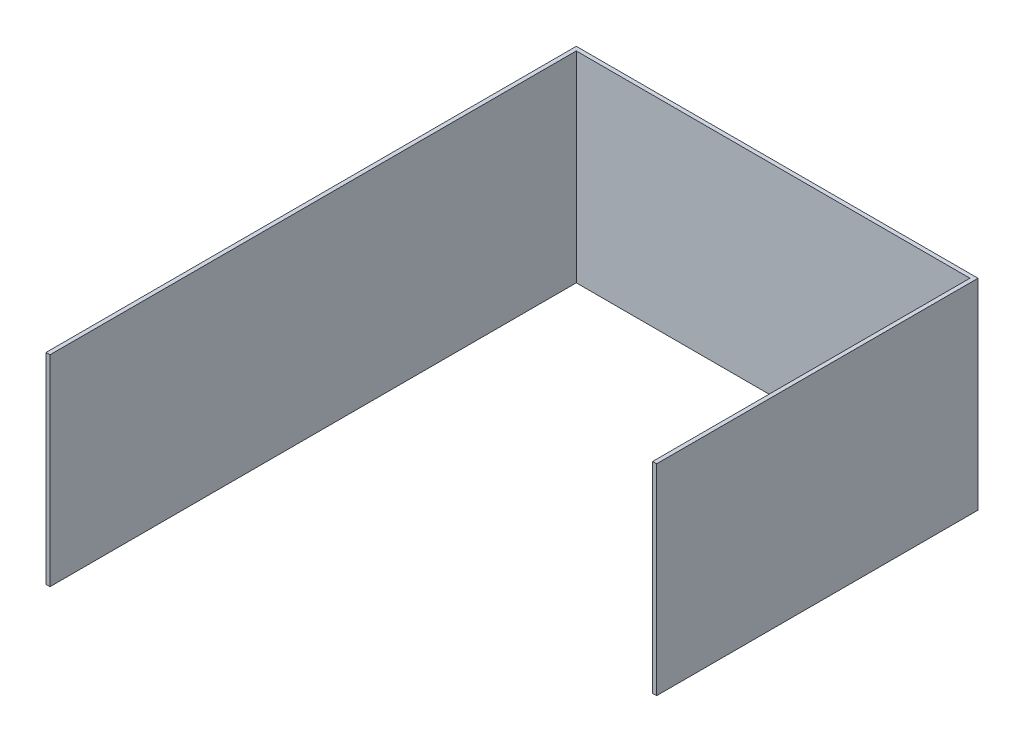
ISO-10303-21;
HEADER;
FILE_DESCRIPTION(('STEP AP214'),'2;1');
FILE_NAME('part.step','',(''),(''),'','','');
FILE_SCHEMA(('AUTOMOTIVE_DESIGN { 1 0 10303 214 1 1 1 1 }'));
ENDSEC;
DATA;
#1=APPLICATION_CONTEXT('core data for automotive mechanical design processes');
#2=APPLICATION_PROTOCOL_DEFINITION('international standard','automotive_design',2000,#1);
#3=PRODUCT_CONTEXT('',#1,'mechanical');
#4=PRODUCT('Part','Part','',(#3));
#5=PRODUCT_RELATED_PRODUCT_CATEGORY('part','',(#4));
#6=PRODUCT_DEFINITION_FORMATION('','',#4);
#7=PRODUCT_DEFINITION_CONTEXT('part definition',#1,'design');
#8=PRODUCT_DEFINITION('design','',#6,#7);
#9=PRODUCT_DEFINITION_SHAPE('','',#8);
#10=(LENGTH_UNIT() NAMED_UNIT(*) SI_UNIT(.MILLI.,.METRE.));
#11=(NAMED_UNIT(*) PLANE_ANGLE_UNIT() SI_UNIT($,.RADIAN.));
#12=(NAMED_UNIT(*) SI_UNIT($,.STERADIAN.) SOLID_ANGLE_UNIT());
#13=UNCERTAINTY_MEASURE_WITH_UNIT(LENGTH_MEASURE(1.E-05),#10,'distance_accuracy_value','');
#14=(GEOMETRIC_REPRESENTATION_CONTEXT(3) GLOBAL_UNCERTAINTY_ASSIGNED_CONTEXT((#13)) GLOBAL_UNIT_ASSIGNED_CONTEXT((#10,
#11,#12)) REPRESENTATION_CONTEXT('',''));
#15=CARTESIAN_POINT('',(0.,0.,0.));
#16=DIRECTION('',(0.,0.,1.));
#17=DIRECTION('',(1.,0.,0.));
#18=AXIS2_PLACEMENT_3D('',#15,#16,#17);
#19=CARTESIAN_POINT('',(-245.,250.,-495.));
#20=DIRECTION('',(-1.,0.,0.));
#21=DIRECTION('',(0.,0.,1.));
#22=AXIS2_PLACEMENT_3D('',#19,#20,#21);
#23=PLANE('',#22);
#24=DIRECTION('',(0.,0.,-1.));
#25=VECTOR('',#24,1.);
#26=CARTESIAN_POINT('',(-245.,0.,-495.));
#27=LINE('',#26,#25);
#28=CARTESIAN_POINT('',(-245.,0.,160.));
#29=VERTEX_POINT('',#28);
#30=CARTESIAN_POINT('',(-245.,0.,-495.));
#31=VERTEX_POINT('',#30);
#32=EDGE_CURVE('E126',#29,#31,#27,.T.);
#33=ORIENTED_EDGE('',*,*,#32,.T.);
#34=DIRECTION('',(0.,-1.,0.));
#35=VECTOR('',#34,1.);
#36=CARTESIAN_POINT('',(-245.,250.,-495.));
#37=LINE('',#36,#35);
#38=CARTESIAN_POINT('',(-245.,250.,-495.));
#39=VERTEX_POINT('',#38);
#40=EDGE_CURVE('E11',#39,#31,#37,.T.);
#41=ORIENTED_EDGE('',*,*,#40,.F.);
#42=DIRECTION('',(0.,0.,-1.));
#43=VECTOR('',#42,1.);
#44=CARTESIAN_POINT('',(-245.,250.,-495.));
#45=LINE('',#44,#43);
#46=CARTESIAN_POINT('',(-245.,250.,160.));
#47=VERTEX_POINT('',#46);
#48=EDGE_CURVE('E91',#47,#39,#45,.T.);
#49=ORIENTED_EDGE('',*,*,#48,.F.);
#50=DIRECTION('',(0.,1.,0.));
#51=VECTOR('',#50,1.);
#52=CARTESIAN_POINT('',(-245.,250.,160.));
#53=LINE('',#52,#51);
#54=EDGE_CURVE('E131',#29,#47,#53,.T.);
#55=ORIENTED_EDGE('',*,*,#54,.F.);
#56=EDGE_LOOP('',(#33,#41,#49,#55));
#57=FACE_BOUND('',#56,.T.);
#58=ADVANCED_FACE('F39',(#57),#23,.F.);
#59=CARTESIAN_POINT('',(245.,250.,-495.));
#60=DIRECTION('',(0.,0.,-1.));
#61=DIRECTION('',(-1.,0.,0.));
#62=AXIS2_PLACEMENT_3D('',#59,#60,#61);
#63=PLANE('',#62);
#64=DIRECTION('',(1.,0.,0.));
#65=VECTOR('',#64,1.);
#66=CARTESIAN_POINT('',(245.,0.,-495.));
#67=LINE('',#66,#65);
#68=CARTESIAN_POINT('',(245.,0.,-495.));
#69=VERTEX_POINT('',#68);
#70=EDGE_CURVE('E173',#31,#69,#67,.T.);
#71=ORIENTED_EDGE('',*,*,#70,.T.);
#72=DIRECTION('',(0.,-1.,0.));
#73=VECTOR('',#72,1.);
#74=CARTESIAN_POINT('',(245.,250.,-495.));
#75=LINE('',#74,#73);
#76=CARTESIAN_POINT('',(245.,250.,-495.));
#77=VERTEX_POINT('',#76);
#78=EDGE_CURVE('E47',#77,#69,#75,.T.);
#79=ORIENTED_EDGE('',*,*,#78,.F.);
#80=DIRECTION('',(1.,0.,0.));
#81=VECTOR('',#80,1.);
#82=CARTESIAN_POINT('',(245.,250.,-495.));
#83=LINE('',#82,#81);
#84=EDGE_CURVE('E156',#39,#77,#83,.T.);
#85=ORIENTED_EDGE('',*,*,#84,.F.);
#86=ORIENTED_EDGE('',*,*,#40,.T.);
#87=EDGE_LOOP('',(#71,#79,#85,#86));
#88=FACE_BOUND('',#87,.T.);
#89=ADVANCED_FACE('F207',(#88),#63,.F.);
#90=CARTESIAN_POINT('',(245.,250.,0.));
#91=DIRECTION('',(1.,0.,0.));
#92=DIRECTION('',(0.,0.,-1.));
#93=AXIS2_PLACEMENT_3D('',#90,#91,#92);
#94=PLANE('',#93);
#95=DIRECTION('',(0.,0.,1.));
#96=VECTOR('',#95,1.);
#97=CARTESIAN_POINT('',(245.,0.,0.));
#98=LINE('',#97,#96);
#99=CARTESIAN_POINT('',(245.,0.,-100.));
#100=VERTEX_POINT('',#99);
#101=EDGE_CURVE('E176',#69,#100,#98,.T.);
#102=ORIENTED_EDGE('',*,*,#101,.T.);
#103=DIRECTION('',(0.,1.,0.));
#104=VECTOR('',#103,1.);
#105=CARTESIAN_POINT('',(245.,0.,-100.));
#106=LINE('',#105,#104);
#107=CARTESIAN_POINT('',(245.,250.,-100.));
#108=VERTEX_POINT('',#107);
#109=EDGE_CURVE('E54',#100,#108,#106,.T.);
#110=ORIENTED_EDGE('',*,*,#109,.T.);
#111=DIRECTION('',(0.,0.,1.));
#112=VECTOR('',#111,1.);
#113=CARTESIAN_POINT('',(245.,250.,0.));
#114=LINE('',#113,#112);
#115=EDGE_CURVE('E159',#77,#108,#114,.T.);
#116=ORIENTED_EDGE('',*,*,#115,.F.);
#117=ORIENTED_EDGE('',*,*,#78,.T.);
#118=EDGE_LOOP('',(#102,#110,#116,#117));
#119=FACE_BOUND('',#118,.T.);
#120=ADVANCED_FACE('F195',(#119),#94,.F.);
#121=CARTESIAN_POINT('',(250.,250.,-500.));
#122=DIRECTION('',(-1.,0.,0.));
#123=DIRECTION('',(0.,0.,1.));
#124=AXIS2_PLACEMENT_3D('',#121,#122,#123);
#125=PLANE('',#124);
#126=DIRECTION('',(0.,0.,-1.));
#127=VECTOR('',#126,1.);
#128=CARTESIAN_POINT('',(250.,250.,-500.));
#129=LINE('',#128,#127);
#130=CARTESIAN_POINT('',(250.,250.,-100.));
#131=VERTEX_POINT('',#130);
#132=CARTESIAN_POINT('',(250.,250.,-500.));
#133=VERTEX_POINT('',#132);
#134=EDGE_CURVE('E163',#131,#133,#129,.T.);
#135=ORIENTED_EDGE('',*,*,#134,.F.);
#136=DIRECTION('',(0.,1.,0.));
#137=VECTOR('',#136,1.);
#138=CARTESIAN_POINT('',(250.,0.,-100.));
#139=LINE('',#138,#137);
#140=CARTESIAN_POINT('',(250.,0.,-100.));
#141=VERTEX_POINT('',#140);
#142=EDGE_CURVE('E147',#141,#131,#139,.T.);
#143=ORIENTED_EDGE('',*,*,#142,.F.);
#144=DIRECTION('',(0.,0.,-1.));
#145=VECTOR('',#144,1.);
#146=CARTESIAN_POINT('',(250.,0.,-500.));
#147=LINE('',#146,#145);
#148=CARTESIAN_POINT('',(250.,0.,-500.));
#149=VERTEX_POINT('',#148);
#150=EDGE_CURVE('E180',#141,#149,#147,.T.);
#151=ORIENTED_EDGE('',*,*,#150,.T.);
#152=DIRECTION('',(0.,-1.,0.));
#153=VECTOR('',#152,1.);
#154=CARTESIAN_POINT('',(250.,250.,-500.));
#155=LINE('',#154,#153);
#156=EDGE_CURVE('E187',#133,#149,#155,.T.);
#157=ORIENTED_EDGE('',*,*,#156,.F.);
#158=EDGE_LOOP('',(#135,#143,#151,#157));
#159=FACE_BOUND('',#158,.T.);
#160=ADVANCED_FACE('F204',(#159),#125,.F.);
#161=CARTESIAN_POINT('',(-250.,250.,-500.));
#162=DIRECTION('',(0.,0.,1.));
#163=DIRECTION('',(1.,0.,0.));
#164=AXIS2_PLACEMENT_3D('',#161,#162,#163);
#165=PLANE('',#164);
#166=DIRECTION('',(-1.,0.,0.));
#167=VECTOR('',#166,1.);
#168=CARTESIAN_POINT('',(-250.,0.,-500.));
#169=LINE('',#168,#167);
#170=CARTESIAN_POINT('',(-250.,0.,-500.));
#171=VERTEX_POINT('',#170);
#172=EDGE_CURVE('E84',#149,#171,#169,.T.);
#173=ORIENTED_EDGE('',*,*,#172,.T.);
#174=DIRECTION('',(0.,-1.,0.));
#175=VECTOR('',#174,1.);
#176=CARTESIAN_POINT('',(-250.,250.,-500.));
#177=LINE('',#176,#175);
#178=CARTESIAN_POINT('',(-250.,250.,-500.));
#179=VERTEX_POINT('',#178);
#180=EDGE_CURVE('E118',#179,#171,#177,.T.);
#181=ORIENTED_EDGE('',*,*,#180,.F.);
#182=DIRECTION('',(-1.,0.,0.));
#183=VECTOR('',#182,1.);
#184=CARTESIAN_POINT('',(-250.,250.,-500.));
#185=LINE('',#184,#183);
#186=EDGE_CURVE('E63',#133,#179,#185,.T.);
#187=ORIENTED_EDGE('',*,*,#186,.F.);
#188=ORIENTED_EDGE('',*,*,#156,.T.);
#189=EDGE_LOOP('',(#173,#181,#187,#188));
#190=FACE_BOUND('',#189,.T.);
#191=ADVANCED_FACE('F222',(#190),#165,.F.);
#192=CARTESIAN_POINT('',(-250.,250.,0.));
#193=DIRECTION('',(1.,0.,0.));
#194=DIRECTION('',(0.,0.,-1.));
#195=AXIS2_PLACEMENT_3D('',#192,#193,#194);
#196=PLANE('',#195);
#197=DIRECTION('',(0.,0.,1.));
#198=VECTOR('',#197,1.);
#199=CARTESIAN_POINT('',(-250.,0.,0.));
#200=LINE('',#199,#198);
#201=CARTESIAN_POINT('',(-250.,0.,160.));
#202=VERTEX_POINT('',#201);
#203=EDGE_CURVE('E112',#171,#202,#200,.T.);
#204=ORIENTED_EDGE('',*,*,#203,.T.);
#205=DIRECTION('',(0.,-1.,0.));
#206=VECTOR('',#205,1.);
#207=CARTESIAN_POINT('',(-250.,250.,160.));
#208=LINE('',#207,#206);
#209=CARTESIAN_POINT('',(-250.,250.,160.));
#210=VERTEX_POINT('',#209);
#211=EDGE_CURVE('E117',#210,#202,#208,.T.);
#212=ORIENTED_EDGE('',*,*,#211,.F.);
#213=DIRECTION('',(0.,0.,1.));
#214=VECTOR('',#213,1.);
#215=CARTESIAN_POINT('',(-250.,250.,0.));
#216=LINE('',#215,#214);
#217=EDGE_CURVE('E168',#179,#210,#216,.T.);
#218=ORIENTED_EDGE('',*,*,#217,.F.);
#219=ORIENTED_EDGE('',*,*,#180,.T.);
#220=EDGE_LOOP('',(#204,#212,#218,#219));
#221=FACE_BOUND('',#220,.T.);
#222=ADVANCED_FACE('F114',(#221),#196,.F.);
#223=CARTESIAN_POINT('',(0.,250.,0.));
#224=DIRECTION('',(0.,-1.,0.));
#225=DIRECTION('',(0.,0.,-1.));
#226=AXIS2_PLACEMENT_3D('',#223,#224,#225);
#227=PLANE('',#226);
#228=ORIENTED_EDGE('',*,*,#115,.T.);
#229=DIRECTION('',(-1.,0.,0.));
#230=VECTOR('',#229,1.);
#231=CARTESIAN_POINT('',(245.,250.,-100.));
#232=LINE('',#231,#230);
#233=EDGE_CURVE('E143',#131,#108,#232,.T.);
#234=ORIENTED_EDGE('',*,*,#233,.F.);
#235=ORIENTED_EDGE('',*,*,#134,.T.);
#236=ORIENTED_EDGE('',*,*,#186,.T.);
#237=ORIENTED_EDGE('',*,*,#217,.T.);
#238=DIRECTION('',(-1.,0.,0.));
#239=VECTOR('',#238,1.);
#240=CARTESIAN_POINT('',(-250.,250.,160.));
#241=LINE('',#240,#239);
#242=EDGE_CURVE('E135',#47,#210,#241,.T.);
#243=ORIENTED_EDGE('',*,*,#242,.F.);
#244=ORIENTED_EDGE('',*,*,#48,.T.);
#245=ORIENTED_EDGE('',*,*,#84,.T.);
#246=EDGE_LOOP('',(#228,#234,#235,#236,#237,#243,#244,#245));
#247=FACE_BOUND('',#246,.T.);
#248=ADVANCED_FACE('F206',(#247),#227,.F.);
#249=CARTESIAN_POINT('',(0.,0.,0.));
#250=DIRECTION('',(0.,-1.,0.));
#251=DIRECTION('',(0.,0.,-1.));
#252=AXIS2_PLACEMENT_3D('',#249,#250,#251);
#253=PLANE('',#252);
#254=DIRECTION('',(-1.,0.,0.));
#255=VECTOR('',#254,1.);
#256=CARTESIAN_POINT('',(245.,0.,-100.));
#257=LINE('',#256,#255);
#258=EDGE_CURVE('E144',#141,#100,#257,.T.);
#259=ORIENTED_EDGE('',*,*,#258,.T.);
#260=ORIENTED_EDGE('',*,*,#101,.F.);
#261=ORIENTED_EDGE('',*,*,#70,.F.);
#262=ORIENTED_EDGE('',*,*,#32,.F.);
#263=DIRECTION('',(1.,0.,0.));
#264=VECTOR('',#263,1.);
#265=CARTESIAN_POINT('',(-250.,0.,160.));
#266=LINE('',#265,#264);
#267=EDGE_CURVE('E123',#202,#29,#266,.T.);
#268=ORIENTED_EDGE('',*,*,#267,.F.);
#269=ORIENTED_EDGE('',*,*,#203,.F.);
#270=ORIENTED_EDGE('',*,*,#172,.F.);
#271=ORIENTED_EDGE('',*,*,#150,.F.);
#272=EDGE_LOOP('',(#259,#260,#261,#262,#268,#269,#270,#271));
#273=FACE_BOUND('',#272,.T.);
#274=ADVANCED_FACE('F124',(#273),#253,.T.);
#275=CARTESIAN_POINT('',(245.,0.,-100.));
#276=DIRECTION('',(0.,0.,-1.));
#277=DIRECTION('',(-1.,0.,0.));
#278=AXIS2_PLACEMENT_3D('',#275,#276,#277);
#279=PLANE('',#278);
#280=ORIENTED_EDGE('',*,*,#233,.T.);
#281=ORIENTED_EDGE('',*,*,#109,.F.);
#282=ORIENTED_EDGE('',*,*,#258,.F.);
#283=ORIENTED_EDGE('',*,*,#142,.T.);
#284=EDGE_LOOP('',(#280,#281,#282,#283));
#285=FACE_BOUND('',#284,.T.);
#286=ADVANCED_FACE('F200',(#285),#279,.F.);
#287=CARTESIAN_POINT('',(0.,0.,160.));
#288=DIRECTION('',(0.,0.,1.));
#289=DIRECTION('',(1.,0.,0.));
#290=AXIS2_PLACEMENT_3D('',#287,#288,#289);
#291=PLANE('',#290);
#292=ORIENTED_EDGE('',*,*,#211,.T.);
#293=ORIENTED_EDGE('',*,*,#267,.T.);
#294=ORIENTED_EDGE('',*,*,#54,.T.);
#295=ORIENTED_EDGE('',*,*,#242,.T.);
#296=EDGE_LOOP('',(#292,#293,#294,#295));
#297=FACE_BOUND('',#296,.T.);
#298=ADVANCED_FACE('F134',(#297),#291,.T.);
#299=CLOSED_SHELL('',(#58,#89,#120,#160,#191,#222,#248,#274,#286,#298));
#300=MANIFOLD_SOLID_BREP('B2',#299);
#301=ADVANCED_BREP_SHAPE_REPRESENTATION('',(#18,#300),#14);
#302=SHAPE_DEFINITION_REPRESENTATION(#9,#301);
ENDSEC;
END-ISO-10303-21;
